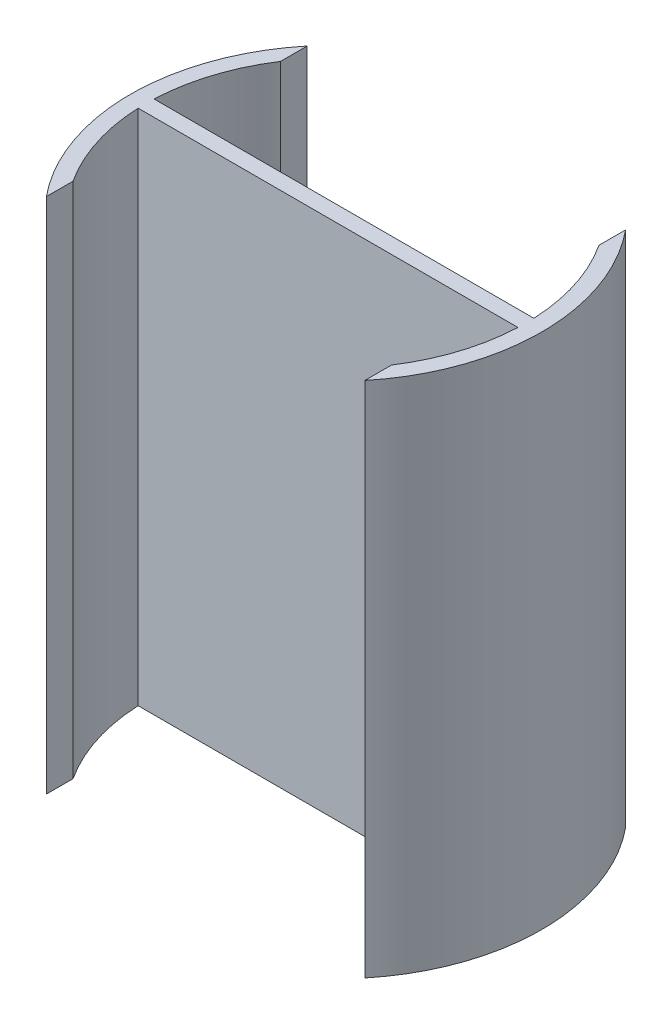
ISO-10303-21;
HEADER;
FILE_DESCRIPTION(('STEP AP214'),'2;1');
FILE_NAME('part.step','',(''),(''),'','','');
FILE_SCHEMA(('AUTOMOTIVE_DESIGN { 1 0 10303 214 1 1 1 1 }'));
ENDSEC;
DATA;
#1=APPLICATION_CONTEXT('core data for automotive mechanical design processes');
#2=APPLICATION_PROTOCOL_DEFINITION('international standard','automotive_design',2000,#1);
#3=PRODUCT_CONTEXT('',#1,'mechanical');
#4=PRODUCT('Part','Part','',(#3));
#5=PRODUCT_RELATED_PRODUCT_CATEGORY('part','',(#4));
#6=PRODUCT_DEFINITION_FORMATION('','',#4);
#7=PRODUCT_DEFINITION_CONTEXT('part definition',#1,'design');
#8=PRODUCT_DEFINITION('design','',#6,#7);
#9=PRODUCT_DEFINITION_SHAPE('','',#8);
#10=(LENGTH_UNIT() NAMED_UNIT(*) SI_UNIT(.MILLI.,.METRE.));
#11=(NAMED_UNIT(*) PLANE_ANGLE_UNIT() SI_UNIT($,.RADIAN.));
#12=(NAMED_UNIT(*) SI_UNIT($,.STERADIAN.) SOLID_ANGLE_UNIT());
#13=UNCERTAINTY_MEASURE_WITH_UNIT(LENGTH_MEASURE(1.E-05),#10,'distance_accuracy_value','');
#14=(GEOMETRIC_REPRESENTATION_CONTEXT(3) GLOBAL_UNCERTAINTY_ASSIGNED_CONTEXT((#13)) GLOBAL_UNIT_ASSIGNED_CONTEXT((#10,
#11,#12)) REPRESENTATION_CONTEXT('',''));
#15=CARTESIAN_POINT('',(0.,0.,0.));
#16=DIRECTION('',(0.,0.,1.));
#17=DIRECTION('',(1.,0.,0.));
#18=AXIS2_PLACEMENT_3D('',#15,#16,#17);
#19=CARTESIAN_POINT('',(0.,65.,0.));
#20=DIRECTION('',(0.,-1.,0.));
#21=DIRECTION('',(0.,0.,-1.));
#22=AXIS2_PLACEMENT_3D('',#19,#20,#21);
#23=CYLINDRICAL_SURFACE('',#22,25.85);
#24=DIRECTION('',(0.,1.,0.));
#25=VECTOR('',#24,1.);
#26=CARTESIAN_POINT('',(20.,-35.,-16.3774998091894));
#27=LINE('',#26,#25);
#28=CARTESIAN_POINT('',(20.,0.,-16.3774998091894));
#29=VERTEX_POINT('',#28);
#30=CARTESIAN_POINT('',(20.,65.,-16.3774998091894));
#31=VERTEX_POINT('',#30);
#32=EDGE_CURVE('E170',#29,#31,#27,.T.);
#33=ORIENTED_EDGE('',*,*,#32,.T.);
#34=CARTESIAN_POINT('',(0.,65.,0.));
#35=DIRECTION('',(0.,1.,0.));
#36=DIRECTION('',(0.,0.,1.));
#37=AXIS2_PLACEMENT_3D('',#34,#35,#36);
#38=CIRCLE('',#37,25.85);
#39=CARTESIAN_POINT('',(20.,65.,16.3774998091894));
#40=VERTEX_POINT('',#39);
#41=EDGE_CURVE('E214',#40,#31,#38,.T.);
#42=ORIENTED_EDGE('',*,*,#41,.F.);
#43=DIRECTION('',(0.,1.,0.));
#44=VECTOR('',#43,1.);
#45=CARTESIAN_POINT('',(20.,-35.,16.3774998091894));
#46=LINE('',#45,#44);
#47=CARTESIAN_POINT('',(20.,0.,16.3774998091894));
#48=VERTEX_POINT('',#47);
#49=EDGE_CURVE('E207',#48,#40,#46,.T.);
#50=ORIENTED_EDGE('',*,*,#49,.F.);
#51=CARTESIAN_POINT('',(0.,0.,0.));
#52=DIRECTION('',(0.,1.,0.));
#53=DIRECTION('',(0.,0.,1.));
#54=AXIS2_PLACEMENT_3D('',#51,#52,#53);
#55=CIRCLE('',#54,25.85);
#56=EDGE_CURVE('E219',#48,#29,#55,.T.);
#57=ORIENTED_EDGE('',*,*,#56,.T.);
#58=EDGE_LOOP('',(#33,#42,#50,#57));
#59=FACE_BOUND('',#58,.T.);
#60=ADVANCED_FACE('F41',(#59),#23,.T.);
#61=CARTESIAN_POINT('',(-20.,65.,-16.3774998091894));
#62=VERTEX_POINT('',#61);
#63=CARTESIAN_POINT('',(-20.,65.,16.3774998091894));
#64=VERTEX_POINT('',#63);
#65=EDGE_CURVE('E218',#62,#64,#38,.T.);
#66=ORIENTED_EDGE('',*,*,#65,.F.);
#67=DIRECTION('',(0.,1.,0.));
#68=VECTOR('',#67,1.);
#69=CARTESIAN_POINT('',(-20.,-35.,-16.3774998091894));
#70=LINE('',#69,#68);
#71=CARTESIAN_POINT('',(-20.,0.,-16.3774998091894));
#72=VERTEX_POINT('',#71);
#73=EDGE_CURVE('E144',#72,#62,#70,.T.);
#74=ORIENTED_EDGE('',*,*,#73,.F.);
#75=CARTESIAN_POINT('',(-20.,0.,16.3774998091894));
#76=VERTEX_POINT('',#75);
#77=EDGE_CURVE('E169',#72,#76,#55,.T.);
#78=ORIENTED_EDGE('',*,*,#77,.T.);
#79=DIRECTION('',(0.,1.,0.));
#80=VECTOR('',#79,1.);
#81=CARTESIAN_POINT('',(-20.,-35.,16.3774998091894));
#82=LINE('',#81,#80);
#83=EDGE_CURVE('E64',#76,#64,#82,.T.);
#84=ORIENTED_EDGE('',*,*,#83,.T.);
#85=EDGE_LOOP('',(#66,#74,#78,#84));
#86=FACE_BOUND('',#85,.T.);
#87=ADVANCED_FACE('F270',(#86),#23,.T.);
#88=CARTESIAN_POINT('',(0.,65.,0.));
#89=DIRECTION('',(0.,1.,0.));
#90=DIRECTION('',(0.,0.,1.));
#91=AXIS2_PLACEMENT_3D('',#88,#89,#90);
#92=PLANE('',#91);
#93=DIRECTION('',(0.,0.,1.));
#94=VECTOR('',#93,1.);
#95=CARTESIAN_POINT('',(-20.,65.,0.));
#96=LINE('',#95,#94);
#97=CARTESIAN_POINT('',(-20.,65.,-13.0315962184223));
#98=VERTEX_POINT('',#97);
#99=EDGE_CURVE('E141',#62,#98,#96,.T.);
#100=ORIENTED_EDGE('',*,*,#99,.F.);
#101=ORIENTED_EDGE('',*,*,#65,.T.);
#102=DIRECTION('',(0.,0.,1.));
#103=VECTOR('',#102,1.);
#104=CARTESIAN_POINT('',(-20.,65.,0.));
#105=LINE('',#104,#103);
#106=CARTESIAN_POINT('',(-20.,65.,13.0315962184223));
#107=VERTEX_POINT('',#106);
#108=EDGE_CURVE('E186',#107,#64,#105,.T.);
#109=ORIENTED_EDGE('',*,*,#108,.F.);
#110=CARTESIAN_POINT('',(0.,65.,0.));
#111=DIRECTION('',(0.,1.,0.));
#112=DIRECTION('',(0.,0.,1.));
#113=AXIS2_PLACEMENT_3D('',#110,#111,#112);
#114=CIRCLE('',#113,23.8709551547482);
#115=CARTESIAN_POINT('',(-23.85,65.,1.));
#116=VERTEX_POINT('',#115);
#117=EDGE_CURVE('E182',#107,#116,#114,.F.);
#118=ORIENTED_EDGE('',*,*,#117,.T.);
#119=DIRECTION('',(-1.,0.,0.));
#120=VECTOR('',#119,1.);
#121=CARTESIAN_POINT('',(0.,65.,1.));
#122=LINE('',#121,#120);
#123=CARTESIAN_POINT('',(23.85,65.,1.));
#124=VERTEX_POINT('',#123);
#125=EDGE_CURVE('E194',#124,#116,#122,.T.);
#126=ORIENTED_EDGE('',*,*,#125,.F.);
#127=CARTESIAN_POINT('',(20.,65.,13.0315962184224));
#128=VERTEX_POINT('',#127);
#129=EDGE_CURVE('E187',#124,#128,#114,.F.);
#130=ORIENTED_EDGE('',*,*,#129,.T.);
#131=DIRECTION('',(0.,0.,1.));
#132=VECTOR('',#131,1.);
#133=CARTESIAN_POINT('',(20.,65.,0.));
#134=LINE('',#133,#132);
#135=EDGE_CURVE('E190',#128,#40,#134,.T.);
#136=ORIENTED_EDGE('',*,*,#135,.T.);
#137=ORIENTED_EDGE('',*,*,#41,.T.);
#138=DIRECTION('',(0.,0.,1.));
#139=VECTOR('',#138,1.);
#140=CARTESIAN_POINT('',(20.,65.,0.));
#141=LINE('',#140,#139);
#142=CARTESIAN_POINT('',(20.,65.,-13.0315962184224));
#143=VERTEX_POINT('',#142);
#144=EDGE_CURVE('E138',#31,#143,#141,.T.);
#145=ORIENTED_EDGE('',*,*,#144,.T.);
#146=CARTESIAN_POINT('',(0.,65.,0.));
#147=DIRECTION('',(0.,1.,0.));
#148=DIRECTION('',(0.,0.,1.));
#149=AXIS2_PLACEMENT_3D('',#146,#147,#148);
#150=CIRCLE('',#149,23.8709551547482);
#151=CARTESIAN_POINT('',(23.85,65.,-1.));
#152=VERTEX_POINT('',#151);
#153=EDGE_CURVE('E157',#143,#152,#150,.F.);
#154=ORIENTED_EDGE('',*,*,#153,.T.);
#155=DIRECTION('',(1.,0.,0.));
#156=VECTOR('',#155,1.);
#157=CARTESIAN_POINT('',(0.,65.,-1.));
#158=LINE('',#157,#156);
#159=CARTESIAN_POINT('',(-23.85,65.,-1.));
#160=VERTEX_POINT('',#159);
#161=EDGE_CURVE('E154',#160,#152,#158,.T.);
#162=ORIENTED_EDGE('',*,*,#161,.F.);
#163=EDGE_CURVE('E132',#160,#98,#150,.F.);
#164=ORIENTED_EDGE('',*,*,#163,.T.);
#165=EDGE_LOOP('',(#100,#101,#109,#118,#126,#130,#136,#137,#145,#154,#162,#164));
#166=FACE_BOUND('',#165,.T.);
#167=ADVANCED_FACE('F151',(#166),#92,.T.);
#168=CARTESIAN_POINT('',(0.,0.,0.));
#169=DIRECTION('',(0.,1.,0.));
#170=DIRECTION('',(0.,0.,1.));
#171=AXIS2_PLACEMENT_3D('',#168,#169,#170);
#172=PLANE('',#171);
#173=ORIENTED_EDGE('',*,*,#77,.F.);
#174=DIRECTION('',(0.,0.,1.));
#175=VECTOR('',#174,1.);
#176=CARTESIAN_POINT('',(-20.,0.,0.));
#177=LINE('',#176,#175);
#178=CARTESIAN_POINT('',(-20.,0.,-13.0315962184223));
#179=VERTEX_POINT('',#178);
#180=EDGE_CURVE('E11',#72,#179,#177,.T.);
#181=ORIENTED_EDGE('',*,*,#180,.T.);
#182=CARTESIAN_POINT('',(0.,0.,0.));
#183=DIRECTION('',(0.,1.,0.));
#184=DIRECTION('',(0.,0.,1.));
#185=AXIS2_PLACEMENT_3D('',#182,#183,#184);
#186=CIRCLE('',#185,23.8709551547482);
#187=CARTESIAN_POINT('',(-23.85,0.,-1.));
#188=VERTEX_POINT('',#187);
#189=EDGE_CURVE('E135',#188,#179,#186,.F.);
#190=ORIENTED_EDGE('',*,*,#189,.F.);
#191=DIRECTION('',(1.,0.,0.));
#192=VECTOR('',#191,1.);
#193=CARTESIAN_POINT('',(0.,0.,-1.));
#194=LINE('',#193,#192);
#195=CARTESIAN_POINT('',(23.85,0.,-1.));
#196=VERTEX_POINT('',#195);
#197=EDGE_CURVE('E240',#188,#196,#194,.T.);
#198=ORIENTED_EDGE('',*,*,#197,.T.);
#199=CARTESIAN_POINT('',(0.,0.,0.));
#200=DIRECTION('',(0.,1.,0.));
#201=DIRECTION('',(0.,0.,1.));
#202=AXIS2_PLACEMENT_3D('',#199,#200,#201);
#203=CIRCLE('',#202,23.8709551547482);
#204=CARTESIAN_POINT('',(20.,0.,-13.0315962184224));
#205=VERTEX_POINT('',#204);
#206=EDGE_CURVE('E244',#205,#196,#203,.F.);
#207=ORIENTED_EDGE('',*,*,#206,.F.);
#208=DIRECTION('',(0.,0.,1.));
#209=VECTOR('',#208,1.);
#210=CARTESIAN_POINT('',(20.,0.,0.));
#211=LINE('',#210,#209);
#212=EDGE_CURVE('E49',#29,#205,#211,.T.);
#213=ORIENTED_EDGE('',*,*,#212,.F.);
#214=ORIENTED_EDGE('',*,*,#56,.F.);
#215=DIRECTION('',(0.,0.,1.));
#216=VECTOR('',#215,1.);
#217=CARTESIAN_POINT('',(20.,0.,0.));
#218=LINE('',#217,#216);
#219=CARTESIAN_POINT('',(20.,0.,13.0315962184224));
#220=VERTEX_POINT('',#219);
#221=EDGE_CURVE('E235',#220,#48,#218,.T.);
#222=ORIENTED_EDGE('',*,*,#221,.F.);
#223=CARTESIAN_POINT('',(0.,0.,0.));
#224=DIRECTION('',(0.,1.,0.));
#225=DIRECTION('',(0.,0.,1.));
#226=AXIS2_PLACEMENT_3D('',#223,#224,#225);
#227=CIRCLE('',#226,23.8709551547482);
#228=CARTESIAN_POINT('',(23.85,0.,1.));
#229=VERTEX_POINT('',#228);
#230=EDGE_CURVE('E232',#229,#220,#227,.F.);
#231=ORIENTED_EDGE('',*,*,#230,.F.);
#232=DIRECTION('',(-1.,0.,0.));
#233=VECTOR('',#232,1.);
#234=CARTESIAN_POINT('',(0.,0.,1.));
#235=LINE('',#234,#233);
#236=CARTESIAN_POINT('',(-23.85,0.,1.));
#237=VERTEX_POINT('',#236);
#238=EDGE_CURVE('E228',#229,#237,#235,.T.);
#239=ORIENTED_EDGE('',*,*,#238,.T.);
#240=CARTESIAN_POINT('',(0.,0.,0.));
#241=DIRECTION('',(0.,1.,0.));
#242=DIRECTION('',(0.,0.,1.));
#243=AXIS2_PLACEMENT_3D('',#240,#241,#242);
#244=CIRCLE('',#243,23.8709551547482);
#245=CARTESIAN_POINT('',(-20.,0.,13.0315962184223));
#246=VERTEX_POINT('',#245);
#247=EDGE_CURVE('E225',#246,#237,#244,.F.);
#248=ORIENTED_EDGE('',*,*,#247,.F.);
#249=DIRECTION('',(0.,0.,1.));
#250=VECTOR('',#249,1.);
#251=CARTESIAN_POINT('',(-20.,0.,0.));
#252=LINE('',#251,#250);
#253=EDGE_CURVE('E217',#246,#76,#252,.T.);
#254=ORIENTED_EDGE('',*,*,#253,.T.);
#255=EDGE_LOOP('',(#173,#181,#190,#198,#207,#213,#214,#222,#231,#239,#248,#254));
#256=FACE_BOUND('',#255,.T.);
#257=ADVANCED_FACE('F258',(#256),#172,.F.);
#258=CARTESIAN_POINT('',(0.,-35.,0.));
#259=DIRECTION('',(0.,1.,0.));
#260=DIRECTION('',(0.,0.,1.));
#261=AXIS2_PLACEMENT_3D('',#258,#259,#260);
#262=CYLINDRICAL_SURFACE('',#261,23.8709551547482);
#263=ORIENTED_EDGE('',*,*,#247,.T.);
#264=DIRECTION('',(0.,1.,0.));
#265=VECTOR('',#264,1.);
#266=CARTESIAN_POINT('',(-23.85,-35.,1.));
#267=LINE('',#266,#265);
#268=EDGE_CURVE('E149',#237,#116,#267,.T.);
#269=ORIENTED_EDGE('',*,*,#268,.T.);
#270=ORIENTED_EDGE('',*,*,#117,.F.);
#271=DIRECTION('',(0.,1.,0.));
#272=VECTOR('',#271,1.);
#273=CARTESIAN_POINT('',(-20.,-35.,13.0315962184223));
#274=LINE('',#273,#272);
#275=EDGE_CURVE('E198',#246,#107,#274,.T.);
#276=ORIENTED_EDGE('',*,*,#275,.F.);
#277=EDGE_LOOP('',(#263,#269,#270,#276));
#278=FACE_BOUND('',#277,.T.);
#279=ADVANCED_FACE('F296',(#278),#262,.F.);
#280=CARTESIAN_POINT('',(0.,-35.,1.));
#281=DIRECTION('',(0.,0.,-1.));
#282=DIRECTION('',(-1.,0.,0.));
#283=AXIS2_PLACEMENT_3D('',#280,#281,#282);
#284=PLANE('',#283);
#285=DIRECTION('',(0.,1.,0.));
#286=VECTOR('',#285,1.);
#287=CARTESIAN_POINT('',(23.85,-35.,1.));
#288=LINE('',#287,#286);
#289=EDGE_CURVE('E201',#229,#124,#288,.T.);
#290=ORIENTED_EDGE('',*,*,#289,.T.);
#291=ORIENTED_EDGE('',*,*,#125,.T.);
#292=ORIENTED_EDGE('',*,*,#268,.F.);
#293=ORIENTED_EDGE('',*,*,#238,.F.);
#294=EDGE_LOOP('',(#290,#291,#292,#293));
#295=FACE_BOUND('',#294,.T.);
#296=ADVANCED_FACE('F292',(#295),#284,.F.);
#297=ORIENTED_EDGE('',*,*,#230,.T.);
#298=DIRECTION('',(0.,1.,0.));
#299=VECTOR('',#298,1.);
#300=CARTESIAN_POINT('',(20.,-35.,13.0315962184224));
#301=LINE('',#300,#299);
#302=EDGE_CURVE('E204',#220,#128,#301,.T.);
#303=ORIENTED_EDGE('',*,*,#302,.T.);
#304=ORIENTED_EDGE('',*,*,#129,.F.);
#305=ORIENTED_EDGE('',*,*,#289,.F.);
#306=EDGE_LOOP('',(#297,#303,#304,#305));
#307=FACE_BOUND('',#306,.T.);
#308=ADVANCED_FACE('F290',(#307),#262,.F.);
#309=CARTESIAN_POINT('',(20.,-35.,0.));
#310=DIRECTION('',(-1.,0.,0.));
#311=DIRECTION('',(0.,0.,1.));
#312=AXIS2_PLACEMENT_3D('',#309,#310,#311);
#313=PLANE('',#312);
#314=ORIENTED_EDGE('',*,*,#221,.T.);
#315=ORIENTED_EDGE('',*,*,#49,.T.);
#316=ORIENTED_EDGE('',*,*,#135,.F.);
#317=ORIENTED_EDGE('',*,*,#302,.F.);
#318=EDGE_LOOP('',(#314,#315,#316,#317));
#319=FACE_BOUND('',#318,.T.);
#320=ADVANCED_FACE('F284',(#319),#313,.T.);
#321=CARTESIAN_POINT('',(-20.,-35.,0.));
#322=DIRECTION('',(-1.,0.,0.));
#323=DIRECTION('',(0.,0.,1.));
#324=AXIS2_PLACEMENT_3D('',#321,#322,#323);
#325=PLANE('',#324);
#326=ORIENTED_EDGE('',*,*,#275,.T.);
#327=ORIENTED_EDGE('',*,*,#108,.T.);
#328=ORIENTED_EDGE('',*,*,#83,.F.);
#329=ORIENTED_EDGE('',*,*,#253,.F.);
#330=EDGE_LOOP('',(#326,#327,#328,#329));
#331=FACE_BOUND('',#330,.T.);
#332=ADVANCED_FACE('F302',(#331),#325,.F.);
#333=CARTESIAN_POINT('',(-20.,-35.,0.));
#334=DIRECTION('',(-1.,0.,0.));
#335=DIRECTION('',(0.,0.,1.));
#336=AXIS2_PLACEMENT_3D('',#333,#334,#335);
#337=PLANE('',#336);
#338=ORIENTED_EDGE('',*,*,#73,.T.);
#339=ORIENTED_EDGE('',*,*,#99,.T.);
#340=DIRECTION('',(0.,1.,0.));
#341=VECTOR('',#340,1.);
#342=CARTESIAN_POINT('',(-20.,-35.,-13.0315962184223));
#343=LINE('',#342,#341);
#344=EDGE_CURVE('E128',#179,#98,#343,.T.);
#345=ORIENTED_EDGE('',*,*,#344,.F.);
#346=ORIENTED_EDGE('',*,*,#180,.F.);
#347=EDGE_LOOP('',(#338,#339,#345,#346));
#348=FACE_BOUND('',#347,.T.);
#349=ADVANCED_FACE('F142',(#348),#337,.F.);
#350=CARTESIAN_POINT('',(20.,-35.,0.));
#351=DIRECTION('',(-1.,0.,0.));
#352=DIRECTION('',(0.,0.,1.));
#353=AXIS2_PLACEMENT_3D('',#350,#351,#352);
#354=PLANE('',#353);
#355=ORIENTED_EDGE('',*,*,#212,.T.);
#356=DIRECTION('',(0.,1.,0.));
#357=VECTOR('',#356,1.);
#358=CARTESIAN_POINT('',(20.,-35.,-13.0315962184224));
#359=LINE('',#358,#357);
#360=EDGE_CURVE('E174',#205,#143,#359,.T.);
#361=ORIENTED_EDGE('',*,*,#360,.T.);
#362=ORIENTED_EDGE('',*,*,#144,.F.);
#363=ORIENTED_EDGE('',*,*,#32,.F.);
#364=EDGE_LOOP('',(#355,#361,#362,#363));
#365=FACE_BOUND('',#364,.T.);
#366=ADVANCED_FACE('F250',(#365),#354,.T.);
#367=CARTESIAN_POINT('',(0.,-35.,0.));
#368=DIRECTION('',(0.,1.,0.));
#369=DIRECTION('',(0.,0.,1.));
#370=AXIS2_PLACEMENT_3D('',#367,#368,#369);
#371=CYLINDRICAL_SURFACE('',#370,23.8709551547482);
#372=ORIENTED_EDGE('',*,*,#206,.T.);
#373=DIRECTION('',(0.,1.,0.));
#374=VECTOR('',#373,1.);
#375=CARTESIAN_POINT('',(23.85,-35.,-1.));
#376=LINE('',#375,#374);
#377=EDGE_CURVE('E177',#196,#152,#376,.T.);
#378=ORIENTED_EDGE('',*,*,#377,.T.);
#379=ORIENTED_EDGE('',*,*,#153,.F.);
#380=ORIENTED_EDGE('',*,*,#360,.F.);
#381=EDGE_LOOP('',(#372,#378,#379,#380));
#382=FACE_BOUND('',#381,.T.);
#383=ADVANCED_FACE('F255',(#382),#371,.F.);
#384=CARTESIAN_POINT('',(0.,-35.,-1.));
#385=DIRECTION('',(0.,0.,1.));
#386=DIRECTION('',(1.,0.,0.));
#387=AXIS2_PLACEMENT_3D('',#384,#385,#386);
#388=PLANE('',#387);
#389=DIRECTION('',(0.,1.,0.));
#390=VECTOR('',#389,1.);
#391=CARTESIAN_POINT('',(-23.85,-35.,-1.));
#392=LINE('',#391,#390);
#393=EDGE_CURVE('E56',#188,#160,#392,.T.);
#394=ORIENTED_EDGE('',*,*,#393,.T.);
#395=ORIENTED_EDGE('',*,*,#161,.T.);
#396=ORIENTED_EDGE('',*,*,#377,.F.);
#397=ORIENTED_EDGE('',*,*,#197,.F.);
#398=EDGE_LOOP('',(#394,#395,#396,#397));
#399=FACE_BOUND('',#398,.T.);
#400=ADVANCED_FACE('F260',(#399),#388,.F.);
#401=ORIENTED_EDGE('',*,*,#189,.T.);
#402=ORIENTED_EDGE('',*,*,#344,.T.);
#403=ORIENTED_EDGE('',*,*,#163,.F.);
#404=ORIENTED_EDGE('',*,*,#393,.F.);
#405=EDGE_LOOP('',(#401,#402,#403,#404));
#406=FACE_BOUND('',#405,.T.);
#407=ADVANCED_FACE('F130',(#406),#371,.F.);
#408=CLOSED_SHELL('',(#60,#87,#167,#257,#279,#296,#308,#320,#332,#349,#366,#383,#400,#407));
#409=MANIFOLD_SOLID_BREP('B2',#408);
#410=ADVANCED_BREP_SHAPE_REPRESENTATION('',(#18,#409),#14);
#411=SHAPE_DEFINITION_REPRESENTATION(#9,#410);
ENDSEC;
END-ISO-10303-21;
